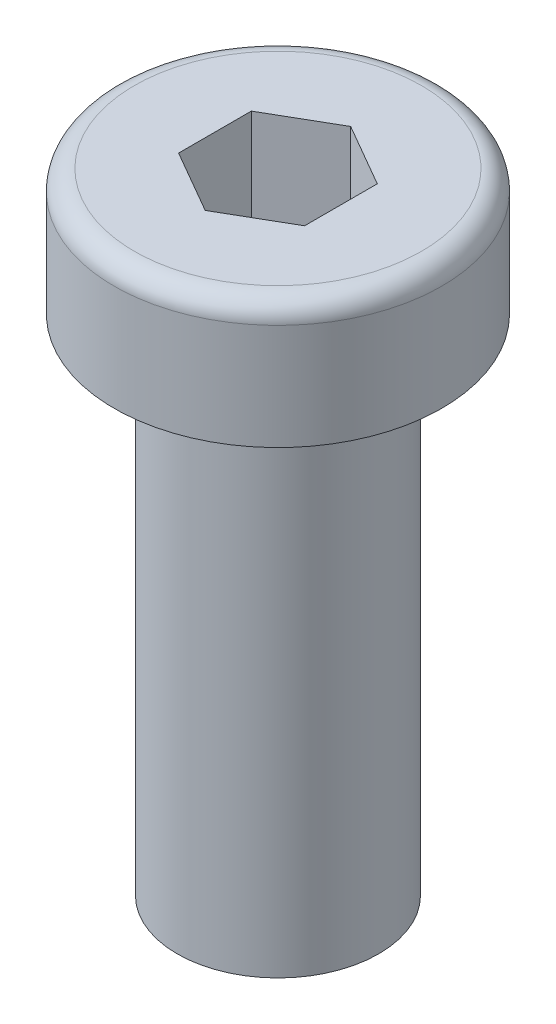
ISO-10303-21;
HEADER;
FILE_DESCRIPTION(('STEP AP214'),'2;1');
FILE_NAME('part.step','',(''),(''),'','','');
FILE_SCHEMA(('AUTOMOTIVE_DESIGN { 1 0 10303 214 1 1 1 1 }'));
ENDSEC;
DATA;
#1=APPLICATION_CONTEXT('core data for automotive mechanical design processes');
#2=APPLICATION_PROTOCOL_DEFINITION('international standard','automotive_design',2000,#1);
#3=PRODUCT_CONTEXT('',#1,'mechanical');
#4=PRODUCT('Part','Part','',(#3));
#5=PRODUCT_RELATED_PRODUCT_CATEGORY('part','',(#4));
#6=PRODUCT_DEFINITION_FORMATION('','',#4);
#7=PRODUCT_DEFINITION_CONTEXT('part definition',#1,'design');
#8=PRODUCT_DEFINITION('design','',#6,#7);
#9=PRODUCT_DEFINITION_SHAPE('','',#8);
#10=(LENGTH_UNIT() NAMED_UNIT(*) SI_UNIT(.MILLI.,.METRE.));
#11=(NAMED_UNIT(*) PLANE_ANGLE_UNIT() SI_UNIT($,.RADIAN.));
#12=(NAMED_UNIT(*) SI_UNIT($,.STERADIAN.) SOLID_ANGLE_UNIT());
#13=UNCERTAINTY_MEASURE_WITH_UNIT(LENGTH_MEASURE(1.E-05),#10,'distance_accuracy_value','');
#14=(GEOMETRIC_REPRESENTATION_CONTEXT(3) GLOBAL_UNCERTAINTY_ASSIGNED_CONTEXT((#13)) GLOBAL_UNIT_ASSIGNED_CONTEXT((#10,
#11,#12)) REPRESENTATION_CONTEXT('',''));
#15=CARTESIAN_POINT('',(0.,0.,0.));
#16=DIRECTION('',(0.,0.,1.));
#17=DIRECTION('',(1.,0.,0.));
#18=AXIS2_PLACEMENT_3D('',#15,#16,#17);
#19=CARTESIAN_POINT('',(0.,25.,0.));
#20=DIRECTION('',(0.,-1.,0.));
#21=DIRECTION('',(0.,0.,-1.));
#22=AXIS2_PLACEMENT_3D('',#19,#20,#21);
#23=PLANE('',#22);
#24=DIRECTION('',(-0.866025403784439,0.,0.5));
#25=VECTOR('',#24,1.);
#26=CARTESIAN_POINT('',(0.,25.,-2.88675134594813));
#27=LINE('',#26,#25);
#28=CARTESIAN_POINT('',(0.,25.,-2.88675134594813));
#29=VERTEX_POINT('',#28);
#30=CARTESIAN_POINT('',(-2.5,25.,-1.44337567297407));
#31=VERTEX_POINT('',#30);
#32=EDGE_CURVE('E125',#29,#31,#27,.T.);
#33=ORIENTED_EDGE('',*,*,#32,.F.);
#34=DIRECTION('',(-0.866025403784439,0.,-0.5));
#35=VECTOR('',#34,1.);
#36=CARTESIAN_POINT('',(2.5,25.,-1.44337567297406));
#37=LINE('',#36,#35);
#38=CARTESIAN_POINT('',(2.5,25.,-1.44337567297406));
#39=VERTEX_POINT('',#38);
#40=EDGE_CURVE('E51',#39,#29,#37,.T.);
#41=ORIENTED_EDGE('',*,*,#40,.F.);
#42=DIRECTION('',(0.,0.,-1.));
#43=VECTOR('',#42,1.);
#44=CARTESIAN_POINT('',(2.5,25.,1.44337567297407));
#45=LINE('',#44,#43);
#46=CARTESIAN_POINT('',(2.5,25.,1.44337567297407));
#47=VERTEX_POINT('',#46);
#48=EDGE_CURVE('E134',#47,#39,#45,.T.);
#49=ORIENTED_EDGE('',*,*,#48,.F.);
#50=DIRECTION('',(0.866025403784439,0.,-0.5));
#51=VECTOR('',#50,1.);
#52=CARTESIAN_POINT('',(0.,25.,2.88675134594813));
#53=LINE('',#52,#51);
#54=CARTESIAN_POINT('',(0.,25.,2.88675134594813));
#55=VERTEX_POINT('',#54);
#56=EDGE_CURVE('E132',#55,#47,#53,.T.);
#57=ORIENTED_EDGE('',*,*,#56,.F.);
#58=DIRECTION('',(0.866025403784439,0.,0.5));
#59=VECTOR('',#58,1.);
#60=CARTESIAN_POINT('',(-2.5,25.,1.44337567297407));
#61=LINE('',#60,#59);
#62=CARTESIAN_POINT('',(-2.5,25.,1.44337567297407));
#63=VERTEX_POINT('',#62);
#64=EDGE_CURVE('E99',#63,#55,#61,.T.);
#65=ORIENTED_EDGE('',*,*,#64,.F.);
#66=DIRECTION('',(0.,0.,1.));
#67=VECTOR('',#66,1.);
#68=CARTESIAN_POINT('',(-2.5,25.,-1.44337567297407));
#69=LINE('',#68,#67);
#70=EDGE_CURVE('E128',#31,#63,#69,.T.);
#71=ORIENTED_EDGE('',*,*,#70,.F.);
#72=EDGE_LOOP('',(#33,#41,#49,#57,#65,#71));
#73=FACE_BOUND('',#72,.T.);
#74=CARTESIAN_POINT('',(0.,25.,0.));
#75=DIRECTION('',(0.,-1.,0.));
#76=DIRECTION('',(0.,0.,-1.));
#77=AXIS2_PLACEMENT_3D('',#74,#75,#76);
#78=CIRCLE('',#77,5.7);
#79=CARTESIAN_POINT('',(0.,25.,-5.7));
#80=VERTEX_POINT('',#79);
#81=EDGE_CURVE('E11',#80,#80,#78,.T.);
#82=ORIENTED_EDGE('',*,*,#81,.F.);
#83=EDGE_LOOP('',(#82));
#84=FACE_BOUND('',#83,.T.);
#85=ADVANCED_FACE('F37',(#73,#84),#23,.F.);
#86=CARTESIAN_POINT('',(0.,24.2,0.));
#87=DIRECTION('',(0.,-1.,0.));
#88=DIRECTION('',(0.,0.,-1.));
#89=AXIS2_PLACEMENT_3D('',#86,#87,#88);
#90=TOROIDAL_SURFACE('',#89,5.7,0.799999999999999);
#91=CARTESIAN_POINT('',(0.,24.2,0.));
#92=DIRECTION('',(0.,-1.,0.));
#93=DIRECTION('',(0.,0.,-1.));
#94=AXIS2_PLACEMENT_3D('',#91,#92,#93);
#95=CIRCLE('',#94,6.5);
#96=CARTESIAN_POINT('',(0.,24.2,-6.5));
#97=VERTEX_POINT('',#96);
#98=EDGE_CURVE('E44',#97,#97,#95,.T.);
#99=ORIENTED_EDGE('',*,*,#98,.F.);
#100=EDGE_LOOP('',(#99));
#101=FACE_BOUND('',#100,.T.);
#102=ORIENTED_EDGE('',*,*,#81,.T.);
#103=EDGE_LOOP('',(#102));
#104=FACE_BOUND('',#103,.T.);
#105=ADVANCED_FACE('F156',(#101,#104),#90,.T.);
#106=CARTESIAN_POINT('',(0.,0.,0.));
#107=DIRECTION('',(0.,-1.,0.));
#108=DIRECTION('',(0.,0.,-1.));
#109=AXIS2_PLACEMENT_3D('',#106,#107,#108);
#110=CYLINDRICAL_SURFACE('',#109,6.5);
#111=CARTESIAN_POINT('',(0.,20.,0.));
#112=DIRECTION('',(0.,-1.,0.));
#113=DIRECTION('',(0.,0.,-1.));
#114=AXIS2_PLACEMENT_3D('',#111,#112,#113);
#115=CIRCLE('',#114,6.5);
#116=CARTESIAN_POINT('',(0.,20.,-6.5));
#117=VERTEX_POINT('',#116);
#118=EDGE_CURVE('E149',#117,#117,#115,.T.);
#119=ORIENTED_EDGE('',*,*,#118,.F.);
#120=EDGE_LOOP('',(#119));
#121=FACE_BOUND('',#120,.T.);
#122=ORIENTED_EDGE('',*,*,#98,.T.);
#123=EDGE_LOOP('',(#122));
#124=FACE_BOUND('',#123,.T.);
#125=ADVANCED_FACE('F154',(#121,#124),#110,.T.);
#126=CARTESIAN_POINT('',(-6.5,20.,0.));
#127=DIRECTION('',(0.,1.,0.));
#128=DIRECTION('',(0.,0.,1.));
#129=AXIS2_PLACEMENT_3D('',#126,#127,#128);
#130=PLANE('',#129);
#131=CARTESIAN_POINT('',(0.,20.,0.));
#132=DIRECTION('',(0.,-1.,0.));
#133=DIRECTION('',(0.,0.,-1.));
#134=AXIS2_PLACEMENT_3D('',#131,#132,#133);
#135=CIRCLE('',#134,4.);
#136=CARTESIAN_POINT('',(0.,20.,-4.));
#137=VERTEX_POINT('',#136);
#138=EDGE_CURVE('E146',#137,#137,#135,.T.);
#139=ORIENTED_EDGE('',*,*,#138,.F.);
#140=EDGE_LOOP('',(#139));
#141=FACE_BOUND('',#140,.T.);
#142=ORIENTED_EDGE('',*,*,#118,.T.);
#143=EDGE_LOOP('',(#142));
#144=FACE_BOUND('',#143,.T.);
#145=ADVANCED_FACE('F189',(#141,#144),#130,.F.);
#146=CARTESIAN_POINT('',(0.,0.,0.));
#147=DIRECTION('',(0.,-1.,0.));
#148=DIRECTION('',(0.,0.,-1.));
#149=AXIS2_PLACEMENT_3D('',#146,#147,#148);
#150=CYLINDRICAL_SURFACE('',#149,4.);
#151=CARTESIAN_POINT('',(0.,0.,0.));
#152=DIRECTION('',(0.,-1.,0.));
#153=DIRECTION('',(0.,0.,-1.));
#154=AXIS2_PLACEMENT_3D('',#151,#152,#153);
#155=CIRCLE('',#154,4.);
#156=CARTESIAN_POINT('',(0.,0.,-4.));
#157=VERTEX_POINT('',#156);
#158=EDGE_CURVE('E138',#157,#157,#155,.T.);
#159=ORIENTED_EDGE('',*,*,#158,.F.);
#160=EDGE_LOOP('',(#159));
#161=FACE_BOUND('',#160,.T.);
#162=ORIENTED_EDGE('',*,*,#138,.T.);
#163=EDGE_LOOP('',(#162));
#164=FACE_BOUND('',#163,.T.);
#165=ADVANCED_FACE('F181',(#161,#164),#150,.T.);
#166=CARTESIAN_POINT('',(-4.,0.,0.));
#167=DIRECTION('',(0.,1.,0.));
#168=DIRECTION('',(0.,0.,1.));
#169=AXIS2_PLACEMENT_3D('',#166,#167,#168);
#170=PLANE('',#169);
#171=ORIENTED_EDGE('',*,*,#158,.T.);
#172=EDGE_LOOP('',(#171));
#173=FACE_BOUND('',#172,.T.);
#174=ADVANCED_FACE('F175',(#173),#170,.F.);
#175=CARTESIAN_POINT('',(2.5,20.8,-1.44337567297406));
#176=DIRECTION('',(0.5,0.,-0.866025403784439));
#177=DIRECTION('',(-0.866025403784439,0.,-0.5));
#178=AXIS2_PLACEMENT_3D('',#175,#176,#177);
#179=PLANE('',#178);
#180=ORIENTED_EDGE('',*,*,#40,.T.);
#181=DIRECTION('',(0.,1.,0.));
#182=VECTOR('',#181,1.);
#183=CARTESIAN_POINT('',(0.,20.8,-2.88675134594813));
#184=LINE('',#183,#182);
#185=CARTESIAN_POINT('',(0.,20.8,-2.88675134594813));
#186=VERTEX_POINT('',#185);
#187=EDGE_CURVE('E81',#186,#29,#184,.T.);
#188=ORIENTED_EDGE('',*,*,#187,.F.);
#189=DIRECTION('',(-0.866025403784439,0.,-0.5));
#190=VECTOR('',#189,1.);
#191=CARTESIAN_POINT('',(2.5,20.8,-1.44337567297406));
#192=LINE('',#191,#190);
#193=CARTESIAN_POINT('',(2.5,20.8,-1.44337567297406));
#194=VERTEX_POINT('',#193);
#195=EDGE_CURVE('E136',#194,#186,#192,.T.);
#196=ORIENTED_EDGE('',*,*,#195,.F.);
#197=DIRECTION('',(0.,1.,0.));
#198=VECTOR('',#197,1.);
#199=CARTESIAN_POINT('',(2.5,20.8,-1.44337567297406));
#200=LINE('',#199,#198);
#201=EDGE_CURVE('E59',#194,#39,#200,.T.);
#202=ORIENTED_EDGE('',*,*,#201,.T.);
#203=EDGE_LOOP('',(#180,#188,#196,#202));
#204=FACE_BOUND('',#203,.T.);
#205=ADVANCED_FACE('F173',(#204),#179,.F.);
#206=CARTESIAN_POINT('',(2.5,20.8,1.44337567297407));
#207=DIRECTION('',(1.,0.,0.));
#208=DIRECTION('',(0.,0.,-1.));
#209=AXIS2_PLACEMENT_3D('',#206,#207,#208);
#210=PLANE('',#209);
#211=ORIENTED_EDGE('',*,*,#48,.T.);
#212=ORIENTED_EDGE('',*,*,#201,.F.);
#213=DIRECTION('',(0.,0.,-1.));
#214=VECTOR('',#213,1.);
#215=CARTESIAN_POINT('',(2.5,20.8,1.44337567297407));
#216=LINE('',#215,#214);
#217=CARTESIAN_POINT('',(2.5,20.8,1.44337567297407));
#218=VERTEX_POINT('',#217);
#219=EDGE_CURVE('E111',#218,#194,#216,.T.);
#220=ORIENTED_EDGE('',*,*,#219,.F.);
#221=DIRECTION('',(0.,1.,0.));
#222=VECTOR('',#221,1.);
#223=CARTESIAN_POINT('',(2.5,20.8,1.44337567297407));
#224=LINE('',#223,#222);
#225=EDGE_CURVE('E103',#218,#47,#224,.T.);
#226=ORIENTED_EDGE('',*,*,#225,.T.);
#227=EDGE_LOOP('',(#211,#212,#220,#226));
#228=FACE_BOUND('',#227,.T.);
#229=ADVANCED_FACE('F174',(#228),#210,.F.);
#230=CARTESIAN_POINT('',(0.,20.8,2.88675134594813));
#231=DIRECTION('',(0.5,0.,0.866025403784439));
#232=DIRECTION('',(0.866025403784439,0.,-0.5));
#233=AXIS2_PLACEMENT_3D('',#230,#231,#232);
#234=PLANE('',#233);
#235=ORIENTED_EDGE('',*,*,#56,.T.);
#236=ORIENTED_EDGE('',*,*,#225,.F.);
#237=DIRECTION('',(0.866025403784439,0.,-0.5));
#238=VECTOR('',#237,1.);
#239=CARTESIAN_POINT('',(0.,20.8,2.88675134594813));
#240=LINE('',#239,#238);
#241=CARTESIAN_POINT('',(0.,20.8,2.88675134594813));
#242=VERTEX_POINT('',#241);
#243=EDGE_CURVE('E107',#242,#218,#240,.T.);
#244=ORIENTED_EDGE('',*,*,#243,.F.);
#245=DIRECTION('',(0.,1.,0.));
#246=VECTOR('',#245,1.);
#247=CARTESIAN_POINT('',(0.,20.8,2.88675134594813));
#248=LINE('',#247,#246);
#249=EDGE_CURVE('E92',#242,#55,#248,.T.);
#250=ORIENTED_EDGE('',*,*,#249,.T.);
#251=EDGE_LOOP('',(#235,#236,#244,#250));
#252=FACE_BOUND('',#251,.T.);
#253=ADVANCED_FACE('F108',(#252),#234,.F.);
#254=CARTESIAN_POINT('',(-2.5,20.8,1.44337567297407));
#255=DIRECTION('',(-0.5,0.,0.866025403784439));
#256=DIRECTION('',(0.866025403784439,0.,0.5));
#257=AXIS2_PLACEMENT_3D('',#254,#255,#256);
#258=PLANE('',#257);
#259=ORIENTED_EDGE('',*,*,#64,.T.);
#260=ORIENTED_EDGE('',*,*,#249,.F.);
#261=DIRECTION('',(0.866025403784439,0.,0.5));
#262=VECTOR('',#261,1.);
#263=CARTESIAN_POINT('',(-2.5,20.8,1.44337567297407));
#264=LINE('',#263,#262);
#265=CARTESIAN_POINT('',(-2.5,20.8,1.44337567297407));
#266=VERTEX_POINT('',#265);
#267=EDGE_CURVE('E96',#266,#242,#264,.T.);
#268=ORIENTED_EDGE('',*,*,#267,.F.);
#269=DIRECTION('',(0.,1.,0.));
#270=VECTOR('',#269,1.);
#271=CARTESIAN_POINT('',(-2.5,20.8,1.44337567297407));
#272=LINE('',#271,#270);
#273=EDGE_CURVE('E104',#266,#63,#272,.T.);
#274=ORIENTED_EDGE('',*,*,#273,.T.);
#275=EDGE_LOOP('',(#259,#260,#268,#274));
#276=FACE_BOUND('',#275,.T.);
#277=ADVANCED_FACE('F94',(#276),#258,.F.);
#278=CARTESIAN_POINT('',(-2.5,20.8,-1.44337567297407));
#279=DIRECTION('',(-1.,0.,0.));
#280=DIRECTION('',(0.,0.,1.));
#281=AXIS2_PLACEMENT_3D('',#278,#279,#280);
#282=PLANE('',#281);
#283=ORIENTED_EDGE('',*,*,#70,.T.);
#284=ORIENTED_EDGE('',*,*,#273,.F.);
#285=DIRECTION('',(0.,0.,1.));
#286=VECTOR('',#285,1.);
#287=CARTESIAN_POINT('',(-2.5,20.8,-1.44337567297407));
#288=LINE('',#287,#286);
#289=CARTESIAN_POINT('',(-2.5,20.8,-1.44337567297407));
#290=VERTEX_POINT('',#289);
#291=EDGE_CURVE('E117',#290,#266,#288,.T.);
#292=ORIENTED_EDGE('',*,*,#291,.F.);
#293=DIRECTION('',(0.,1.,0.));
#294=VECTOR('',#293,1.);
#295=CARTESIAN_POINT('',(-2.5,20.8,-1.44337567297407));
#296=LINE('',#295,#294);
#297=EDGE_CURVE('E141',#290,#31,#296,.T.);
#298=ORIENTED_EDGE('',*,*,#297,.T.);
#299=EDGE_LOOP('',(#283,#284,#292,#298));
#300=FACE_BOUND('',#299,.T.);
#301=ADVANCED_FACE('F233',(#300),#282,.F.);
#302=CARTESIAN_POINT('',(0.,20.8,-2.88675134594813));
#303=DIRECTION('',(-0.5,0.,-0.866025403784439));
#304=DIRECTION('',(-0.866025403784439,0.,0.5));
#305=AXIS2_PLACEMENT_3D('',#302,#303,#304);
#306=PLANE('',#305);
#307=ORIENTED_EDGE('',*,*,#32,.T.);
#308=ORIENTED_EDGE('',*,*,#297,.F.);
#309=DIRECTION('',(-0.866025403784439,0.,0.5));
#310=VECTOR('',#309,1.);
#311=CARTESIAN_POINT('',(0.,20.8,-2.88675134594813));
#312=LINE('',#311,#310);
#313=EDGE_CURVE('E119',#186,#290,#312,.T.);
#314=ORIENTED_EDGE('',*,*,#313,.F.);
#315=ORIENTED_EDGE('',*,*,#187,.T.);
#316=EDGE_LOOP('',(#307,#308,#314,#315));
#317=FACE_BOUND('',#316,.T.);
#318=ADVANCED_FACE('F171',(#317),#306,.F.);
#319=CARTESIAN_POINT('',(0.,20.8,0.));
#320=DIRECTION('',(0.,1.,0.));
#321=DIRECTION('',(0.,0.,1.));
#322=AXIS2_PLACEMENT_3D('',#319,#320,#321);
#323=PLANE('',#322);
#324=ORIENTED_EDGE('',*,*,#195,.T.);
#325=ORIENTED_EDGE('',*,*,#313,.T.);
#326=ORIENTED_EDGE('',*,*,#291,.T.);
#327=ORIENTED_EDGE('',*,*,#267,.T.);
#328=ORIENTED_EDGE('',*,*,#243,.T.);
#329=ORIENTED_EDGE('',*,*,#219,.T.);
#330=EDGE_LOOP('',(#324,#325,#326,#327,#328,#329));
#331=FACE_BOUND('',#330,.T.);
#332=ADVANCED_FACE('F114',(#331),#323,.T.);
#333=CLOSED_SHELL('',(#85,#105,#125,#145,#165,#174,#205,#229,#253,#277,#301,#318,#332));
#334=MANIFOLD_SOLID_BREP('B2',#333);
#335=ADVANCED_BREP_SHAPE_REPRESENTATION('',(#18,#334),#14);
#336=SHAPE_DEFINITION_REPRESENTATION(#9,#335);
ENDSEC;
END-ISO-10303-21;
